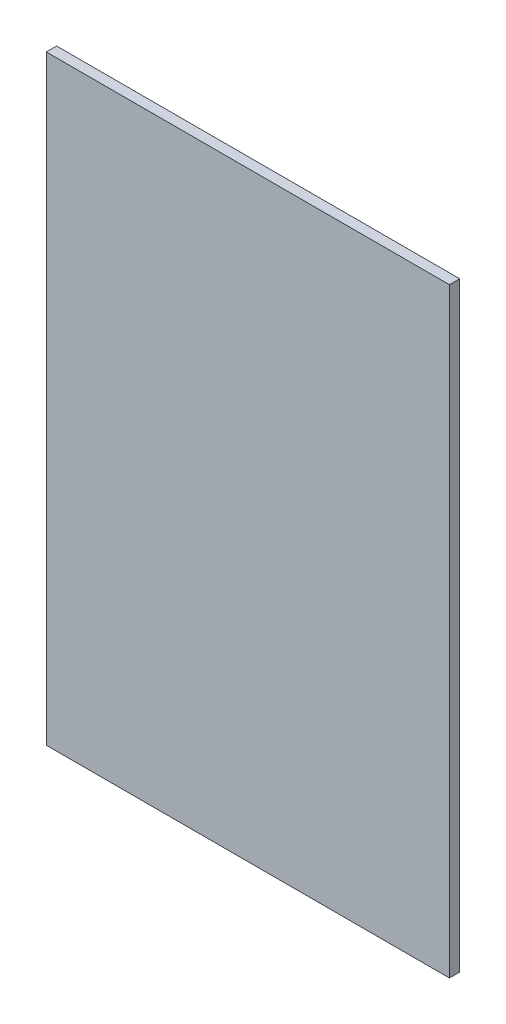
ISO-10303-21;
HEADER;
FILE_DESCRIPTION(('STEP AP214'),'2;1');
FILE_NAME('part.step','',(''),(''),'','','');
FILE_SCHEMA(('AUTOMOTIVE_DESIGN { 1 0 10303 214 1 1 1 1 }'));
ENDSEC;
DATA;
#1=APPLICATION_CONTEXT('core data for automotive mechanical design processes');
#2=APPLICATION_PROTOCOL_DEFINITION('international standard','automotive_design',2000,#1);
#3=PRODUCT_CONTEXT('',#1,'mechanical');
#4=PRODUCT('Part','Part','',(#3));
#5=PRODUCT_RELATED_PRODUCT_CATEGORY('part','',(#4));
#6=PRODUCT_DEFINITION_FORMATION('','',#4);
#7=PRODUCT_DEFINITION_CONTEXT('part definition',#1,'design');
#8=PRODUCT_DEFINITION('design','',#6,#7);
#9=PRODUCT_DEFINITION_SHAPE('','',#8);
#10=(LENGTH_UNIT() NAMED_UNIT(*) SI_UNIT(.MILLI.,.METRE.));
#11=(NAMED_UNIT(*) PLANE_ANGLE_UNIT() SI_UNIT($,.RADIAN.));
#12=(NAMED_UNIT(*) SI_UNIT($,.STERADIAN.) SOLID_ANGLE_UNIT());
#13=UNCERTAINTY_MEASURE_WITH_UNIT(LENGTH_MEASURE(1.E-05),#10,'distance_accuracy_value','');
#14=(GEOMETRIC_REPRESENTATION_CONTEXT(3) GLOBAL_UNCERTAINTY_ASSIGNED_CONTEXT((#13)) GLOBAL_UNIT_ASSIGNED_CONTEXT((#10,
#11,#12)) REPRESENTATION_CONTEXT('',''));
#15=CARTESIAN_POINT('',(0.,0.,0.));
#16=DIRECTION('',(0.,0.,1.));
#17=DIRECTION('',(1.,0.,0.));
#18=AXIS2_PLACEMENT_3D('',#15,#16,#17);
#19=CARTESIAN_POINT('',(235.,-350.,12.));
#20=DIRECTION('',(-1.,0.,0.));
#21=DIRECTION('',(0.,0.,1.));
#22=AXIS2_PLACEMENT_3D('',#19,#20,#21);
#23=PLANE('',#22);
#24=DIRECTION('',(0.,1.,0.));
#25=VECTOR('',#24,1.);
#26=CARTESIAN_POINT('',(235.,-350.,0.));
#27=LINE('',#26,#25);
#28=CARTESIAN_POINT('',(235.,-350.,0.));
#29=VERTEX_POINT('',#28);
#30=CARTESIAN_POINT('',(235.,350.,0.));
#31=VERTEX_POINT('',#30);
#32=EDGE_CURVE('E96',#29,#31,#27,.T.);
#33=ORIENTED_EDGE('',*,*,#32,.T.);
#34=DIRECTION('',(0.,0.,-1.));
#35=VECTOR('',#34,1.);
#36=CARTESIAN_POINT('',(235.,350.,12.));
#37=LINE('',#36,#35);
#38=CARTESIAN_POINT('',(235.,350.,12.));
#39=VERTEX_POINT('',#38);
#40=EDGE_CURVE('E11',#39,#31,#37,.T.);
#41=ORIENTED_EDGE('',*,*,#40,.F.);
#42=DIRECTION('',(0.,1.,0.));
#43=VECTOR('',#42,1.);
#44=CARTESIAN_POINT('',(235.,-350.,12.));
#45=LINE('',#44,#43);
#46=CARTESIAN_POINT('',(235.,-350.,12.));
#47=VERTEX_POINT('',#46);
#48=EDGE_CURVE('E84',#47,#39,#45,.T.);
#49=ORIENTED_EDGE('',*,*,#48,.F.);
#50=DIRECTION('',(0.,0.,-1.));
#51=VECTOR('',#50,1.);
#52=CARTESIAN_POINT('',(235.,-350.,12.));
#53=LINE('',#52,#51);
#54=EDGE_CURVE('E92',#47,#29,#53,.T.);
#55=ORIENTED_EDGE('',*,*,#54,.T.);
#56=EDGE_LOOP('',(#33,#41,#49,#55));
#57=FACE_BOUND('',#56,.T.);
#58=ADVANCED_FACE('F33',(#57),#23,.F.);
#59=CARTESIAN_POINT('',(-235.,350.,12.));
#60=DIRECTION('',(0.,-1.,0.));
#61=DIRECTION('',(0.,0.,-1.));
#62=AXIS2_PLACEMENT_3D('',#59,#60,#61);
#63=PLANE('',#62);
#64=DIRECTION('',(-1.,0.,0.));
#65=VECTOR('',#64,1.);
#66=CARTESIAN_POINT('',(-235.,350.,0.));
#67=LINE('',#66,#65);
#68=CARTESIAN_POINT('',(-235.,350.,0.));
#69=VERTEX_POINT('',#68);
#70=EDGE_CURVE('E88',#31,#69,#67,.T.);
#71=ORIENTED_EDGE('',*,*,#70,.T.);
#72=DIRECTION('',(0.,0.,-1.));
#73=VECTOR('',#72,1.);
#74=CARTESIAN_POINT('',(-235.,350.,12.));
#75=LINE('',#74,#73);
#76=CARTESIAN_POINT('',(-235.,350.,12.));
#77=VERTEX_POINT('',#76);
#78=EDGE_CURVE('E41',#77,#69,#75,.T.);
#79=ORIENTED_EDGE('',*,*,#78,.F.);
#80=DIRECTION('',(-1.,0.,0.));
#81=VECTOR('',#80,1.);
#82=CARTESIAN_POINT('',(-235.,350.,12.));
#83=LINE('',#82,#81);
#84=EDGE_CURVE('E79',#39,#77,#83,.T.);
#85=ORIENTED_EDGE('',*,*,#84,.F.);
#86=ORIENTED_EDGE('',*,*,#40,.T.);
#87=EDGE_LOOP('',(#71,#79,#85,#86));
#88=FACE_BOUND('',#87,.T.);
#89=ADVANCED_FACE('F87',(#88),#63,.F.);
#90=CARTESIAN_POINT('',(-235.,-350.,12.));
#91=DIRECTION('',(1.,0.,0.));
#92=DIRECTION('',(0.,0.,-1.));
#93=AXIS2_PLACEMENT_3D('',#90,#91,#92);
#94=PLANE('',#93);
#95=DIRECTION('',(0.,-1.,0.));
#96=VECTOR('',#95,1.);
#97=CARTESIAN_POINT('',(-235.,-350.,0.));
#98=LINE('',#97,#96);
#99=CARTESIAN_POINT('',(-235.,-350.,0.));
#100=VERTEX_POINT('',#99);
#101=EDGE_CURVE('E66',#69,#100,#98,.T.);
#102=ORIENTED_EDGE('',*,*,#101,.T.);
#103=DIRECTION('',(0.,0.,-1.));
#104=VECTOR('',#103,1.);
#105=CARTESIAN_POINT('',(-235.,-350.,12.));
#106=LINE('',#105,#104);
#107=CARTESIAN_POINT('',(-235.,-350.,12.));
#108=VERTEX_POINT('',#107);
#109=EDGE_CURVE('E89',#108,#100,#106,.T.);
#110=ORIENTED_EDGE('',*,*,#109,.F.);
#111=DIRECTION('',(0.,-1.,0.));
#112=VECTOR('',#111,1.);
#113=CARTESIAN_POINT('',(-235.,-350.,12.));
#114=LINE('',#113,#112);
#115=EDGE_CURVE('E82',#77,#108,#114,.T.);
#116=ORIENTED_EDGE('',*,*,#115,.F.);
#117=ORIENTED_EDGE('',*,*,#78,.T.);
#118=EDGE_LOOP('',(#102,#110,#116,#117));
#119=FACE_BOUND('',#118,.T.);
#120=ADVANCED_FACE('F90',(#119),#94,.F.);
#121=CARTESIAN_POINT('',(-235.,-350.,12.));
#122=DIRECTION('',(0.,1.,0.));
#123=DIRECTION('',(0.,0.,1.));
#124=AXIS2_PLACEMENT_3D('',#121,#122,#123);
#125=PLANE('',#124);
#126=DIRECTION('',(1.,0.,0.));
#127=VECTOR('',#126,1.);
#128=CARTESIAN_POINT('',(-235.,-350.,0.));
#129=LINE('',#128,#127);
#130=EDGE_CURVE('E72',#100,#29,#129,.T.);
#131=ORIENTED_EDGE('',*,*,#130,.T.);
#132=ORIENTED_EDGE('',*,*,#54,.F.);
#133=DIRECTION('',(1.,0.,0.));
#134=VECTOR('',#133,1.);
#135=CARTESIAN_POINT('',(-235.,-350.,12.));
#136=LINE('',#135,#134);
#137=EDGE_CURVE('E49',#108,#47,#136,.T.);
#138=ORIENTED_EDGE('',*,*,#137,.F.);
#139=ORIENTED_EDGE('',*,*,#109,.T.);
#140=EDGE_LOOP('',(#131,#132,#138,#139));
#141=FACE_BOUND('',#140,.T.);
#142=ADVANCED_FACE('F103',(#141),#125,.F.);
#143=CARTESIAN_POINT('',(0.,0.,12.));
#144=DIRECTION('',(0.,0.,-1.));
#145=DIRECTION('',(-1.,0.,0.));
#146=AXIS2_PLACEMENT_3D('',#143,#144,#145);
#147=PLANE('',#146);
#148=ORIENTED_EDGE('',*,*,#48,.T.);
#149=ORIENTED_EDGE('',*,*,#84,.T.);
#150=ORIENTED_EDGE('',*,*,#115,.T.);
#151=ORIENTED_EDGE('',*,*,#137,.T.);
#152=EDGE_LOOP('',(#148,#149,#150,#151));
#153=FACE_BOUND('',#152,.T.);
#154=ADVANCED_FACE('F80',(#153),#147,.F.);
#155=CARTESIAN_POINT('',(0.,0.,0.));
#156=DIRECTION('',(0.,0.,-1.));
#157=DIRECTION('',(-1.,0.,0.));
#158=AXIS2_PLACEMENT_3D('',#155,#156,#157);
#159=PLANE('',#158);
#160=ORIENTED_EDGE('',*,*,#32,.F.);
#161=ORIENTED_EDGE('',*,*,#130,.F.);
#162=ORIENTED_EDGE('',*,*,#101,.F.);
#163=ORIENTED_EDGE('',*,*,#70,.F.);
#164=EDGE_LOOP('',(#160,#161,#162,#163));
#165=FACE_BOUND('',#164,.T.);
#166=ADVANCED_FACE('F106',(#165),#159,.T.);
#167=CLOSED_SHELL('',(#58,#89,#120,#142,#154,#166));
#168=MANIFOLD_SOLID_BREP('B2',#167);
#169=ADVANCED_BREP_SHAPE_REPRESENTATION('',(#18,#168),#14);
#170=SHAPE_DEFINITION_REPRESENTATION(#9,#169);
ENDSEC;
END-ISO-10303-21;
